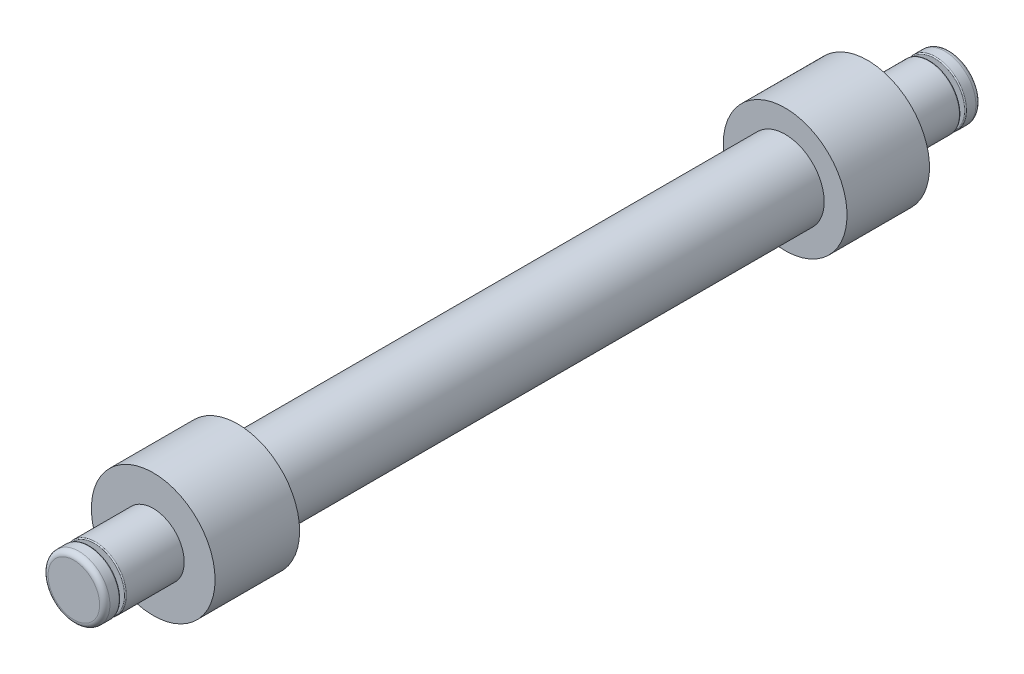
ISO-10303-21;
HEADER;
FILE_DESCRIPTION(('STEP AP214'),'2;1');
FILE_NAME('part.step','',(''),(''),'','','');
FILE_SCHEMA(('AUTOMOTIVE_DESIGN { 1 0 10303 214 1 1 1 1 }'));
ENDSEC;
DATA;
#1=APPLICATION_CONTEXT('core data for automotive mechanical design processes');
#2=APPLICATION_PROTOCOL_DEFINITION('international standard','automotive_design',2000,#1);
#3=PRODUCT_CONTEXT('',#1,'mechanical');
#4=PRODUCT('Part','Part','',(#3));
#5=PRODUCT_RELATED_PRODUCT_CATEGORY('part','',(#4));
#6=PRODUCT_DEFINITION_FORMATION('','',#4);
#7=PRODUCT_DEFINITION_CONTEXT('part definition',#1,'design');
#8=PRODUCT_DEFINITION('design','',#6,#7);
#9=PRODUCT_DEFINITION_SHAPE('','',#8);
#10=(LENGTH_UNIT() NAMED_UNIT(*) SI_UNIT(.MILLI.,.METRE.));
#11=(NAMED_UNIT(*) PLANE_ANGLE_UNIT() SI_UNIT($,.RADIAN.));
#12=(NAMED_UNIT(*) SI_UNIT($,.STERADIAN.) SOLID_ANGLE_UNIT());
#13=UNCERTAINTY_MEASURE_WITH_UNIT(LENGTH_MEASURE(1.E-05),#10,'distance_accuracy_value','');
#14=(GEOMETRIC_REPRESENTATION_CONTEXT(3) GLOBAL_UNCERTAINTY_ASSIGNED_CONTEXT((#13)) GLOBAL_UNIT_ASSIGNED_CONTEXT((#10,
#11,#12)) REPRESENTATION_CONTEXT('',''));
#15=CARTESIAN_POINT('',(0.,0.,0.));
#16=DIRECTION('',(0.,0.,1.));
#17=DIRECTION('',(1.,0.,0.));
#18=AXIS2_PLACEMENT_3D('',#15,#16,#17);
#19=CARTESIAN_POINT('',(-146.151339286049,83.7634571260063,-2.));
#20=DIRECTION('',(0.,0.,1.));
#21=DIRECTION('',(1.,0.,0.));
#22=AXIS2_PLACEMENT_3D('',#19,#20,#21);
#23=CYLINDRICAL_SURFACE('',#22,6.00000000000002);
#24=CARTESIAN_POINT('',(-146.151339286049,83.7634571260063,-2.));
#25=DIRECTION('',(0.,0.,1.));
#26=DIRECTION('',(1.,0.,0.));
#27=AXIS2_PLACEMENT_3D('',#24,#25,#26);
#28=CIRCLE('',#27,6.00000000000002);
#29=CARTESIAN_POINT('',(-140.151339286049,83.7634571260063,-2.));
#30=VERTEX_POINT('',#29);
#31=EDGE_CURVE('E90',#30,#30,#28,.T.);
#32=ORIENTED_EDGE('',*,*,#31,.T.);
#33=EDGE_LOOP('',(#32));
#34=FACE_BOUND('',#33,.T.);
#35=CARTESIAN_POINT('',(-146.151339286049,83.7634571260063,6.2));
#36=DIRECTION('',(0.,0.,1.));
#37=DIRECTION('',(1.,0.,0.));
#38=AXIS2_PLACEMENT_3D('',#35,#36,#37);
#39=CIRCLE('',#38,6.00000000000002);
#40=CARTESIAN_POINT('',(-140.151339286049,83.7634571260063,6.2));
#41=VERTEX_POINT('',#40);
#42=EDGE_CURVE('E94',#41,#41,#39,.T.);
#43=ORIENTED_EDGE('',*,*,#42,.F.);
#44=EDGE_LOOP('',(#43));
#45=FACE_BOUND('',#44,.T.);
#46=ADVANCED_FACE('F33',(#34,#45),#23,.T.);
#47=CARTESIAN_POINT('',(-146.151339286049,83.7634571260063,-2.));
#48=DIRECTION('',(0.,0.,1.));
#49=DIRECTION('',(1.,0.,0.));
#50=AXIS2_PLACEMENT_3D('',#47,#48,#49);
#51=PLANE('',#50);
#52=CARTESIAN_POINT('',(-146.151339286049,83.7634571260063,-2.));
#53=DIRECTION('',(0.,0.,1.));
#54=DIRECTION('',(1.,0.,0.));
#55=AXIS2_PLACEMENT_3D('',#52,#53,#54);
#56=CIRCLE('',#55,3.78487221850976);
#57=CARTESIAN_POINT('',(-142.36646706754,83.7634571260063,-2.));
#58=VERTEX_POINT('',#57);
#59=EDGE_CURVE('E87',#58,#58,#56,.F.);
#60=ORIENTED_EDGE('',*,*,#59,.F.);
#61=EDGE_LOOP('',(#60));
#62=FACE_BOUND('',#61,.T.);
#63=ORIENTED_EDGE('',*,*,#31,.F.);
#64=EDGE_LOOP('',(#63));
#65=FACE_BOUND('',#64,.T.);
#66=ADVANCED_FACE('F133',(#62,#65),#51,.F.);
#67=CARTESIAN_POINT('',(-146.151339286049,83.7634571260063,6.2));
#68=DIRECTION('',(0.,0.,1.));
#69=DIRECTION('',(1.,0.,0.));
#70=AXIS2_PLACEMENT_3D('',#67,#68,#69);
#71=PLANE('',#70);
#72=CARTESIAN_POINT('',(-146.151339286049,83.7634571260063,6.2));
#73=DIRECTION('',(0.,0.,1.));
#74=DIRECTION('',(1.,0.,0.));
#75=AXIS2_PLACEMENT_3D('',#72,#73,#74);
#76=CIRCLE('',#75,3.00388085177558);
#77=CARTESIAN_POINT('',(-143.147458434274,83.7634571260063,6.2));
#78=VERTEX_POINT('',#77);
#79=EDGE_CURVE('E86',#78,#78,#76,.T.);
#80=ORIENTED_EDGE('',*,*,#79,.F.);
#81=EDGE_LOOP('',(#80));
#82=FACE_BOUND('',#81,.T.);
#83=ORIENTED_EDGE('',*,*,#42,.T.);
#84=EDGE_LOOP('',(#83));
#85=FACE_BOUND('',#84,.T.);
#86=ADVANCED_FACE('F139',(#82,#85),#71,.T.);
#87=CARTESIAN_POINT('',(-146.151339286049,83.7634571260063,-55.1));
#88=DIRECTION('',(0.,0.,1.));
#89=DIRECTION('',(1.,0.,0.));
#90=AXIS2_PLACEMENT_3D('',#87,#88,#89);
#91=CYLINDRICAL_SURFACE('',#90,3.78487221850976);
#92=CARTESIAN_POINT('',(-146.151339286049,83.7634571260063,-55.1));
#93=DIRECTION('',(0.,0.,1.));
#94=DIRECTION('',(1.,0.,0.));
#95=AXIS2_PLACEMENT_3D('',#92,#93,#94);
#96=CIRCLE('',#95,3.78487221850976);
#97=CARTESIAN_POINT('',(-142.36646706754,83.7634571260063,-55.1));
#98=VERTEX_POINT('',#97);
#99=EDGE_CURVE('E91',#98,#98,#96,.T.);
#100=ORIENTED_EDGE('',*,*,#99,.T.);
#101=EDGE_LOOP('',(#100));
#102=FACE_BOUND('',#101,.T.);
#103=ORIENTED_EDGE('',*,*,#59,.T.);
#104=EDGE_LOOP('',(#103));
#105=FACE_BOUND('',#104,.T.);
#106=ADVANCED_FACE('F145',(#102,#105),#91,.T.);
#107=CARTESIAN_POINT('',(-146.151339286049,83.7634571260063,-63.1));
#108=DIRECTION('',(0.,0.,1.));
#109=DIRECTION('',(1.,0.,0.));
#110=AXIS2_PLACEMENT_3D('',#107,#108,#109);
#111=CYLINDRICAL_SURFACE('',#110,5.99999999999999);
#112=CARTESIAN_POINT('',(-146.151339286049,83.7634571260063,-63.1));
#113=DIRECTION('',(0.,0.,-1.));
#114=DIRECTION('',(-1.,0.,0.));
#115=AXIS2_PLACEMENT_3D('',#112,#113,#114);
#116=CIRCLE('',#115,5.99999999999999);
#117=CARTESIAN_POINT('',(-152.151339286049,83.7634571260063,-63.1));
#118=VERTEX_POINT('',#117);
#119=EDGE_CURVE('E95',#118,#118,#116,.T.);
#120=ORIENTED_EDGE('',*,*,#119,.F.);
#121=EDGE_LOOP('',(#120));
#122=FACE_BOUND('',#121,.T.);
#123=CARTESIAN_POINT('',(-146.151339286049,83.7634571260063,-55.1));
#124=DIRECTION('',(0.,0.,-1.));
#125=DIRECTION('',(-1.,0.,0.));
#126=AXIS2_PLACEMENT_3D('',#123,#124,#125);
#127=CIRCLE('',#126,5.99999999999999);
#128=CARTESIAN_POINT('',(-152.151339286049,83.7634571260063,-55.1));
#129=VERTEX_POINT('',#128);
#130=EDGE_CURVE('E81',#129,#129,#127,.T.);
#131=ORIENTED_EDGE('',*,*,#130,.T.);
#132=EDGE_LOOP('',(#131));
#133=FACE_BOUND('',#132,.T.);
#134=ADVANCED_FACE('F148',(#122,#133),#111,.T.);
#135=CARTESIAN_POINT('',(-146.151339286049,83.7634571260063,-63.1));
#136=DIRECTION('',(0.,0.,-1.));
#137=DIRECTION('',(-1.,0.,0.));
#138=AXIS2_PLACEMENT_3D('',#135,#136,#137);
#139=PLANE('',#138);
#140=CARTESIAN_POINT('',(-146.151339286049,83.7634571260063,-63.1));
#141=DIRECTION('',(0.,0.,-1.));
#142=DIRECTION('',(-1.,0.,0.));
#143=AXIS2_PLACEMENT_3D('',#140,#141,#142);
#144=CIRCLE('',#143,3.00388085177558);
#145=CARTESIAN_POINT('',(-149.155220137825,83.7634571260063,-63.1));
#146=VERTEX_POINT('',#145);
#147=EDGE_CURVE('E83',#146,#146,#144,.T.);
#148=ORIENTED_EDGE('',*,*,#147,.F.);
#149=EDGE_LOOP('',(#148));
#150=FACE_BOUND('',#149,.T.);
#151=ORIENTED_EDGE('',*,*,#119,.T.);
#152=EDGE_LOOP('',(#151));
#153=FACE_BOUND('',#152,.T.);
#154=ADVANCED_FACE('F315',(#150,#153),#139,.T.);
#155=CARTESIAN_POINT('',(-146.151339286049,83.7634571260063,-55.1));
#156=DIRECTION('',(0.,0.,-1.));
#157=DIRECTION('',(-1.,0.,0.));
#158=AXIS2_PLACEMENT_3D('',#155,#156,#157);
#159=PLANE('',#158);
#160=ORIENTED_EDGE('',*,*,#99,.F.);
#161=EDGE_LOOP('',(#160));
#162=FACE_BOUND('',#161,.T.);
#163=ORIENTED_EDGE('',*,*,#130,.F.);
#164=EDGE_LOOP('',(#163));
#165=FACE_BOUND('',#164,.T.);
#166=ADVANCED_FACE('F308',(#162,#165),#159,.F.);
#167=CARTESIAN_POINT('',(-146.151339286049,83.7634571260063,-69.1));
#168=DIRECTION('',(0.,0.,-1.));
#169=DIRECTION('',(-1.,0.,0.));
#170=AXIS2_PLACEMENT_3D('',#167,#168,#169);
#171=PLANE('',#170);
#172=CARTESIAN_POINT('',(-146.151339286049,83.7634571260063,-69.1));
#173=DIRECTION('',(0.,0.,-1.));
#174=DIRECTION('',(-1.,0.,0.));
#175=AXIS2_PLACEMENT_3D('',#172,#173,#174);
#176=CIRCLE('',#175,2.90388085177558);
#177=CARTESIAN_POINT('',(-149.055220137825,83.7634571260063,-69.1));
#178=VERTEX_POINT('',#177);
#179=EDGE_CURVE('E40',#178,#178,#176,.T.);
#180=ORIENTED_EDGE('',*,*,#179,.T.);
#181=EDGE_LOOP('',(#180));
#182=FACE_BOUND('',#181,.T.);
#183=CARTESIAN_POINT('',(-146.151339286049,83.7634571260063,-69.1));
#184=DIRECTION('',(0.,0.,-1.));
#185=DIRECTION('',(-1.,0.,0.));
#186=AXIS2_PLACEMENT_3D('',#183,#184,#185);
#187=CIRCLE('',#186,1.75000000000001);
#188=CARTESIAN_POINT('',(-147.901339286049,83.7634571260063,-69.1));
#189=VERTEX_POINT('',#188);
#190=EDGE_CURVE('E77',#189,#189,#187,.T.);
#191=ORIENTED_EDGE('',*,*,#190,.F.);
#192=EDGE_LOOP('',(#191));
#193=FACE_BOUND('',#192,.T.);
#194=ADVANCED_FACE('F302',(#182,#193),#171,.T.);
#195=CARTESIAN_POINT('',(-146.151339286049,83.7634571260063,11.9));
#196=DIRECTION('',(0.,0.,-1.));
#197=DIRECTION('',(-1.,0.,0.));
#198=AXIS2_PLACEMENT_3D('',#195,#196,#197);
#199=CYLINDRICAL_SURFACE('',#198,3.00388085177558);
#200=CARTESIAN_POINT('',(-146.151339286049,83.7634571260063,-69.));
#201=DIRECTION('',(0.,0.,-1.));
#202=DIRECTION('',(-1.,0.,0.));
#203=AXIS2_PLACEMENT_3D('',#200,#201,#202);
#204=CIRCLE('',#203,3.00388085177558);
#205=CARTESIAN_POINT('',(-149.155220137825,83.7634571260063,-69.));
#206=VERTEX_POINT('',#205);
#207=EDGE_CURVE('E10',#206,#206,#204,.F.);
#208=ORIENTED_EDGE('',*,*,#207,.T.);
#209=EDGE_LOOP('',(#208));
#210=FACE_BOUND('',#209,.T.);
#211=ORIENTED_EDGE('',*,*,#147,.T.);
#212=EDGE_LOOP('',(#211));
#213=FACE_BOUND('',#212,.T.);
#214=ADVANCED_FACE('F293',(#210,#213),#199,.T.);
#215=CARTESIAN_POINT('',(-146.151339286049,83.7634571260063,11.8));
#216=DIRECTION('',(0.,0.,-1.));
#217=DIRECTION('',(-1.,0.,0.));
#218=AXIS2_PLACEMENT_3D('',#215,#216,#217);
#219=CIRCLE('',#218,3.00388085177558);
#220=CARTESIAN_POINT('',(-149.155220137825,83.7634571260063,11.8));
#221=VERTEX_POINT('',#220);
#222=EDGE_CURVE('E56',#221,#221,#219,.T.);
#223=ORIENTED_EDGE('',*,*,#222,.T.);
#224=EDGE_LOOP('',(#223));
#225=FACE_BOUND('',#224,.T.);
#226=ORIENTED_EDGE('',*,*,#79,.T.);
#227=EDGE_LOOP('',(#226));
#228=FACE_BOUND('',#227,.T.);
#229=ADVANCED_FACE('F284',(#225,#228),#199,.T.);
#230=CARTESIAN_POINT('',(-146.151339286049,83.7634571260063,11.9));
#231=DIRECTION('',(0.,0.,-1.));
#232=DIRECTION('',(-1.,0.,0.));
#233=AXIS2_PLACEMENT_3D('',#230,#231,#232);
#234=PLANE('',#233);
#235=CARTESIAN_POINT('',(-146.151339286049,83.7634571260063,11.9));
#236=DIRECTION('',(0.,0.,-1.));
#237=DIRECTION('',(-1.,0.,0.));
#238=AXIS2_PLACEMENT_3D('',#235,#236,#237);
#239=CIRCLE('',#238,2.90388085177558);
#240=CARTESIAN_POINT('',(-149.055220137825,83.7634571260063,11.9));
#241=VERTEX_POINT('',#240);
#242=EDGE_CURVE('E53',#241,#241,#239,.F.);
#243=ORIENTED_EDGE('',*,*,#242,.T.);
#244=EDGE_LOOP('',(#243));
#245=FACE_BOUND('',#244,.T.);
#246=CARTESIAN_POINT('',(-146.151339286049,83.7634571260063,11.9));
#247=DIRECTION('',(0.,0.,-1.));
#248=DIRECTION('',(-1.,0.,0.));
#249=AXIS2_PLACEMENT_3D('',#246,#247,#248);
#250=CIRCLE('',#249,1.75000000000001);
#251=CARTESIAN_POINT('',(-147.901339286049,83.7634571260063,11.9));
#252=VERTEX_POINT('',#251);
#253=EDGE_CURVE('E78',#252,#252,#250,.T.);
#254=ORIENTED_EDGE('',*,*,#253,.T.);
#255=EDGE_LOOP('',(#254));
#256=FACE_BOUND('',#255,.T.);
#257=ADVANCED_FACE('F129',(#245,#256),#234,.F.);
#258=CARTESIAN_POINT('',(-146.151339286049,83.7634571260063,12.4));
#259=DIRECTION('',(0.,0.,-1.));
#260=DIRECTION('',(-1.,0.,0.));
#261=AXIS2_PLACEMENT_3D('',#258,#259,#260);
#262=CYLINDRICAL_SURFACE('',#261,1.75000000000001);
#263=CARTESIAN_POINT('',(-146.151339286049,83.7634571260063,12.4));
#264=DIRECTION('',(0.,0.,-1.));
#265=DIRECTION('',(-1.,0.,0.));
#266=AXIS2_PLACEMENT_3D('',#263,#264,#265);
#267=CIRCLE('',#266,1.75000000000001);
#268=CARTESIAN_POINT('',(-147.901339286049,83.7634571260063,12.4));
#269=VERTEX_POINT('',#268);
#270=EDGE_CURVE('E108',#269,#269,#267,.T.);
#271=ORIENTED_EDGE('',*,*,#270,.T.);
#272=EDGE_LOOP('',(#271));
#273=FACE_BOUND('',#272,.T.);
#274=ORIENTED_EDGE('',*,*,#253,.F.);
#275=EDGE_LOOP('',(#274));
#276=FACE_BOUND('',#275,.T.);
#277=ADVANCED_FACE('F119',(#273,#276),#262,.T.);
#278=ORIENTED_EDGE('',*,*,#190,.T.);
#279=EDGE_LOOP('',(#278));
#280=FACE_BOUND('',#279,.T.);
#281=CARTESIAN_POINT('',(-146.151339286049,83.7634571260063,-69.6));
#282=DIRECTION('',(0.,0.,-1.));
#283=DIRECTION('',(-1.,0.,0.));
#284=AXIS2_PLACEMENT_3D('',#281,#282,#283);
#285=CIRCLE('',#284,1.75000000000001);
#286=CARTESIAN_POINT('',(-147.901339286049,83.7634571260063,-69.6));
#287=VERTEX_POINT('',#286);
#288=EDGE_CURVE('E82',#287,#287,#285,.T.);
#289=ORIENTED_EDGE('',*,*,#288,.F.);
#290=EDGE_LOOP('',(#289));
#291=FACE_BOUND('',#290,.T.);
#292=ADVANCED_FACE('F116',(#280,#291),#262,.T.);
#293=CARTESIAN_POINT('',(-146.151339286049,83.7634571260063,-71.1));
#294=DIRECTION('',(0.,0.,1.));
#295=DIRECTION('',(1.,0.,0.));
#296=AXIS2_PLACEMENT_3D('',#293,#294,#295);
#297=CYLINDRICAL_SURFACE('',#296,3.00388085177558);
#298=CARTESIAN_POINT('',(-146.151339286049,83.7634571260063,-69.7));
#299=DIRECTION('',(0.,0.,-1.));
#300=DIRECTION('',(-1.,0.,0.));
#301=AXIS2_PLACEMENT_3D('',#298,#299,#300);
#302=CIRCLE('',#301,3.00388085177558);
#303=CARTESIAN_POINT('',(-149.155220137825,83.7634571260063,-69.7));
#304=VERTEX_POINT('',#303);
#305=EDGE_CURVE('E48',#304,#304,#302,.T.);
#306=ORIENTED_EDGE('',*,*,#305,.T.);
#307=EDGE_LOOP('',(#306));
#308=FACE_BOUND('',#307,.T.);
#309=CARTESIAN_POINT('',(-146.151339286049,83.7634571260063,-70.6));
#310=DIRECTION('',(0.,0.,-1.));
#311=DIRECTION('',(-1.,0.,0.));
#312=AXIS2_PLACEMENT_3D('',#309,#310,#311);
#313=CIRCLE('',#312,3.00388085177558);
#314=CARTESIAN_POINT('',(-149.155220137825,83.7634571260063,-70.6));
#315=VERTEX_POINT('',#314);
#316=EDGE_CURVE('E71',#315,#315,#313,.F.);
#317=ORIENTED_EDGE('',*,*,#316,.T.);
#318=EDGE_LOOP('',(#317));
#319=FACE_BOUND('',#318,.T.);
#320=ADVANCED_FACE('F118',(#308,#319),#297,.T.);
#321=CARTESIAN_POINT('',(-146.151339286049,83.7634571260063,-71.1));
#322=DIRECTION('',(0.,0.,-1.));
#323=DIRECTION('',(-1.,0.,0.));
#324=AXIS2_PLACEMENT_3D('',#321,#322,#323);
#325=PLANE('',#324);
#326=CARTESIAN_POINT('',(-146.151339286049,83.7634571260063,-71.1));
#327=DIRECTION('',(0.,0.,-1.));
#328=DIRECTION('',(-1.,0.,0.));
#329=AXIS2_PLACEMENT_3D('',#326,#327,#328);
#330=CIRCLE('',#329,2.50388085177558);
#331=CARTESIAN_POINT('',(-148.655220137825,83.7634571260063,-71.1));
#332=VERTEX_POINT('',#331);
#333=EDGE_CURVE('E74',#332,#332,#330,.T.);
#334=ORIENTED_EDGE('',*,*,#333,.T.);
#335=EDGE_LOOP('',(#334));
#336=FACE_BOUND('',#335,.T.);
#337=ADVANCED_FACE('F126',(#336),#325,.T.);
#338=CARTESIAN_POINT('',(-146.151339286049,83.7634571260063,-69.6));
#339=DIRECTION('',(0.,0.,-1.));
#340=DIRECTION('',(-1.,0.,0.));
#341=AXIS2_PLACEMENT_3D('',#338,#339,#340);
#342=PLANE('',#341);
#343=CARTESIAN_POINT('',(-146.151339286049,83.7634571260063,-69.6));
#344=DIRECTION('',(0.,0.,-1.));
#345=DIRECTION('',(-1.,0.,0.));
#346=AXIS2_PLACEMENT_3D('',#343,#344,#345);
#347=CIRCLE('',#346,2.90388085177558);
#348=CARTESIAN_POINT('',(-149.055220137825,83.7634571260063,-69.6));
#349=VERTEX_POINT('',#348);
#350=EDGE_CURVE('E44',#349,#349,#347,.F.);
#351=ORIENTED_EDGE('',*,*,#350,.T.);
#352=EDGE_LOOP('',(#351));
#353=FACE_BOUND('',#352,.T.);
#354=ORIENTED_EDGE('',*,*,#288,.T.);
#355=EDGE_LOOP('',(#354));
#356=FACE_BOUND('',#355,.T.);
#357=ADVANCED_FACE('F114',(#353,#356),#342,.F.);
#358=CARTESIAN_POINT('',(-146.151339286049,83.7634571260063,13.9));
#359=DIRECTION('',(0.,0.,-1.));
#360=DIRECTION('',(-1.,0.,0.));
#361=AXIS2_PLACEMENT_3D('',#358,#359,#360);
#362=CYLINDRICAL_SURFACE('',#361,2.99999999999999);
#363=CARTESIAN_POINT('',(-146.151339286049,83.7634571260063,12.5));
#364=DIRECTION('',(0.,0.,1.));
#365=DIRECTION('',(1.,0.,0.));
#366=AXIS2_PLACEMENT_3D('',#363,#364,#365);
#367=CIRCLE('',#366,2.99999999999999);
#368=CARTESIAN_POINT('',(-143.151339286049,83.7634571260063,12.5));
#369=VERTEX_POINT('',#368);
#370=EDGE_CURVE('E62',#369,#369,#367,.T.);
#371=ORIENTED_EDGE('',*,*,#370,.T.);
#372=EDGE_LOOP('',(#371));
#373=FACE_BOUND('',#372,.T.);
#374=CARTESIAN_POINT('',(-146.151339286049,83.7634571260063,13.4));
#375=DIRECTION('',(0.,0.,1.));
#376=DIRECTION('',(1.,0.,0.));
#377=AXIS2_PLACEMENT_3D('',#374,#375,#376);
#378=CIRCLE('',#377,2.99999999999999);
#379=CARTESIAN_POINT('',(-143.151339286049,83.7634571260063,13.4));
#380=VERTEX_POINT('',#379);
#381=EDGE_CURVE('E65',#380,#380,#378,.F.);
#382=ORIENTED_EDGE('',*,*,#381,.T.);
#383=EDGE_LOOP('',(#382));
#384=FACE_BOUND('',#383,.T.);
#385=ADVANCED_FACE('F186',(#373,#384),#362,.T.);
#386=CARTESIAN_POINT('',(-146.151339286049,83.7634571260063,13.9));
#387=DIRECTION('',(0.,0.,1.));
#388=DIRECTION('',(1.,0.,0.));
#389=AXIS2_PLACEMENT_3D('',#386,#387,#388);
#390=PLANE('',#389);
#391=CARTESIAN_POINT('',(-146.151339286049,83.7634571260063,13.9));
#392=DIRECTION('',(0.,0.,1.));
#393=DIRECTION('',(1.,0.,0.));
#394=AXIS2_PLACEMENT_3D('',#391,#392,#393);
#395=CIRCLE('',#394,2.49999999999999);
#396=CARTESIAN_POINT('',(-143.651339286049,83.7634571260063,13.9));
#397=VERTEX_POINT('',#396);
#398=EDGE_CURVE('E68',#397,#397,#395,.T.);
#399=ORIENTED_EDGE('',*,*,#398,.T.);
#400=EDGE_LOOP('',(#399));
#401=FACE_BOUND('',#400,.T.);
#402=ADVANCED_FACE('F192',(#401),#390,.T.);
#403=CARTESIAN_POINT('',(-146.151339286049,83.7634571260063,12.4));
#404=DIRECTION('',(0.,0.,1.));
#405=DIRECTION('',(1.,0.,0.));
#406=AXIS2_PLACEMENT_3D('',#403,#404,#405);
#407=PLANE('',#406);
#408=CARTESIAN_POINT('',(-146.151339286049,83.7634571260063,12.4));
#409=DIRECTION('',(0.,0.,1.));
#410=DIRECTION('',(1.,0.,0.));
#411=AXIS2_PLACEMENT_3D('',#408,#409,#410);
#412=CIRCLE('',#411,2.9);
#413=CARTESIAN_POINT('',(-143.251339286049,83.7634571260063,12.4));
#414=VERTEX_POINT('',#413);
#415=EDGE_CURVE('E59',#414,#414,#412,.F.);
#416=ORIENTED_EDGE('',*,*,#415,.T.);
#417=EDGE_LOOP('',(#416));
#418=FACE_BOUND('',#417,.T.);
#419=ORIENTED_EDGE('',*,*,#270,.F.);
#420=EDGE_LOOP('',(#419));
#421=FACE_BOUND('',#420,.T.);
#422=ADVANCED_FACE('F154',(#418,#421),#407,.F.);
#423=CARTESIAN_POINT('',(-146.151339286049,83.7634571260063,-70.6));
#424=DIRECTION('',(0.,0.,-1.));
#425=DIRECTION('',(-1.,0.,0.));
#426=AXIS2_PLACEMENT_3D('',#423,#424,#425);
#427=TOROIDAL_SURFACE('',#426,2.50388085177558,0.5);
#428=ORIENTED_EDGE('',*,*,#316,.F.);
#429=EDGE_LOOP('',(#428));
#430=FACE_BOUND('',#429,.T.);
#431=ORIENTED_EDGE('',*,*,#333,.F.);
#432=EDGE_LOOP('',(#431));
#433=FACE_BOUND('',#432,.T.);
#434=ADVANCED_FACE('F150',(#430,#433),#427,.T.);
#435=CARTESIAN_POINT('',(-146.151339286049,83.7634571260063,13.4));
#436=DIRECTION('',(0.,0.,1.));
#437=DIRECTION('',(1.,0.,0.));
#438=AXIS2_PLACEMENT_3D('',#435,#436,#437);
#439=TOROIDAL_SURFACE('',#438,2.49999999999999,0.5);
#440=ORIENTED_EDGE('',*,*,#381,.F.);
#441=EDGE_LOOP('',(#440));
#442=FACE_BOUND('',#441,.T.);
#443=ORIENTED_EDGE('',*,*,#398,.F.);
#444=EDGE_LOOP('',(#443));
#445=FACE_BOUND('',#444,.T.);
#446=ADVANCED_FACE('F153',(#442,#445),#439,.T.);
#447=CARTESIAN_POINT('',(-146.151339286049,83.7634571260063,12.5));
#448=DIRECTION('',(0.,0.,1.));
#449=DIRECTION('',(1.,0.,0.));
#450=AXIS2_PLACEMENT_3D('',#447,#448,#449);
#451=TOROIDAL_SURFACE('',#450,2.9,0.1);
#452=ORIENTED_EDGE('',*,*,#415,.F.);
#453=EDGE_LOOP('',(#452));
#454=FACE_BOUND('',#453,.T.);
#455=ORIENTED_EDGE('',*,*,#370,.F.);
#456=EDGE_LOOP('',(#455));
#457=FACE_BOUND('',#456,.T.);
#458=ADVANCED_FACE('F158',(#454,#457),#451,.T.);
#459=CARTESIAN_POINT('',(-146.151339286049,83.7634571260063,11.8));
#460=DIRECTION('',(0.,0.,-1.));
#461=DIRECTION('',(-1.,0.,0.));
#462=AXIS2_PLACEMENT_3D('',#459,#460,#461);
#463=TOROIDAL_SURFACE('',#462,2.90388085177558,0.1);
#464=ORIENTED_EDGE('',*,*,#242,.F.);
#465=EDGE_LOOP('',(#464));
#466=FACE_BOUND('',#465,.T.);
#467=ORIENTED_EDGE('',*,*,#222,.F.);
#468=EDGE_LOOP('',(#467));
#469=FACE_BOUND('',#468,.T.);
#470=ADVANCED_FACE('F162',(#466,#469),#463,.T.);
#471=CARTESIAN_POINT('',(-146.151339286049,83.7634571260063,-69.7));
#472=DIRECTION('',(0.,0.,-1.));
#473=DIRECTION('',(-1.,0.,0.));
#474=AXIS2_PLACEMENT_3D('',#471,#472,#473);
#475=TOROIDAL_SURFACE('',#474,2.90388085177558,0.1);
#476=ORIENTED_EDGE('',*,*,#350,.F.);
#477=EDGE_LOOP('',(#476));
#478=FACE_BOUND('',#477,.T.);
#479=ORIENTED_EDGE('',*,*,#305,.F.);
#480=EDGE_LOOP('',(#479));
#481=FACE_BOUND('',#480,.T.);
#482=ADVANCED_FACE('F165',(#478,#481),#475,.T.);
#483=CARTESIAN_POINT('',(-146.151339286049,83.7634571260063,-69.));
#484=DIRECTION('',(0.,0.,-1.));
#485=DIRECTION('',(-1.,0.,0.));
#486=AXIS2_PLACEMENT_3D('',#483,#484,#485);
#487=TOROIDAL_SURFACE('',#486,2.90388085177558,0.1);
#488=ORIENTED_EDGE('',*,*,#207,.F.);
#489=EDGE_LOOP('',(#488));
#490=FACE_BOUND('',#489,.T.);
#491=ORIENTED_EDGE('',*,*,#179,.F.);
#492=EDGE_LOOP('',(#491));
#493=FACE_BOUND('',#492,.T.);
#494=ADVANCED_FACE('F35',(#490,#493),#487,.T.);
#495=CLOSED_SHELL('',(#46,#66,#86,#106,#134,#154,#166,#194,#214,#229,#257,#277,#292,#320,#337,
#357,#385,#402,#422,#434,#446,#458,#470,#482,#494));
#496=MANIFOLD_SOLID_BREP('B2',#495);
#497=ADVANCED_BREP_SHAPE_REPRESENTATION('',(#18,#496),#14);
#498=SHAPE_DEFINITION_REPRESENTATION(#9,#497);
ENDSEC;
END-ISO-10303-21;
